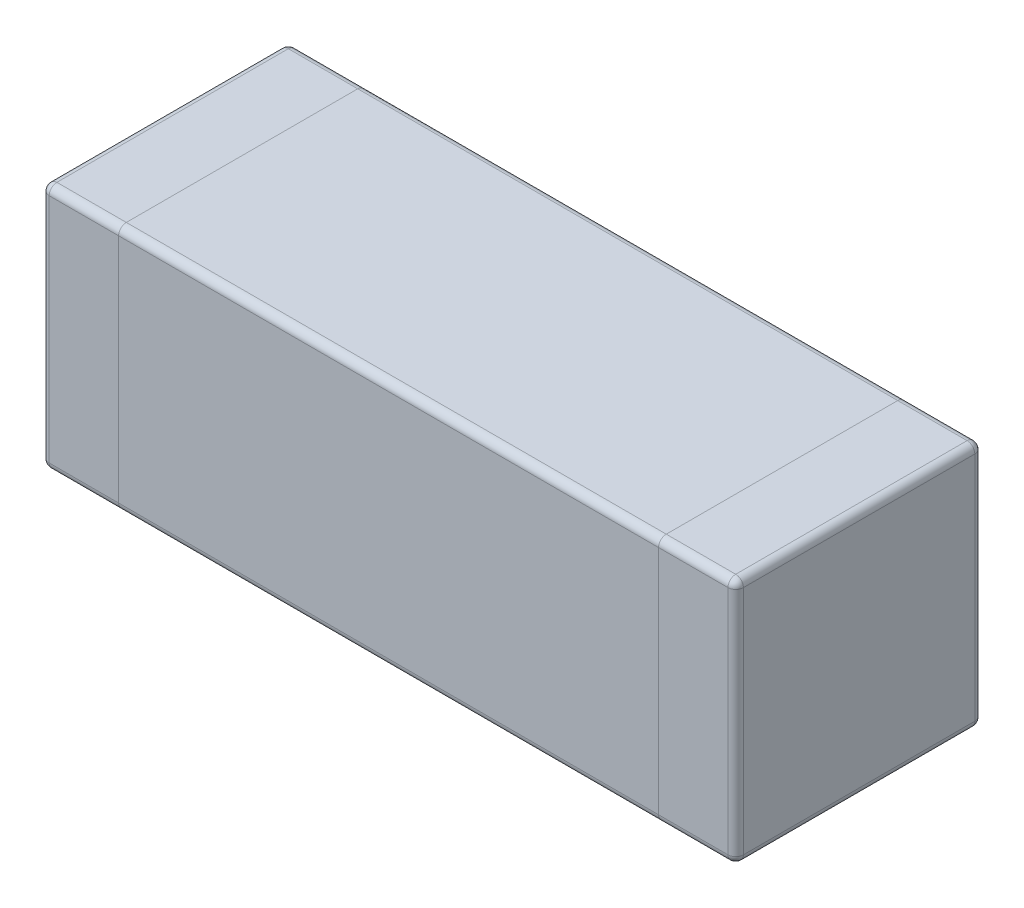
ISO-10303-21;
HEADER;
FILE_DESCRIPTION(('STEP AP214'),'2;1');
FILE_NAME('part.step','',(''),(''),'','','');
FILE_SCHEMA(('AUTOMOTIVE_DESIGN { 1 0 10303 214 1 1 1 1 }'));
ENDSEC;
DATA;
#1=APPLICATION_CONTEXT('core data for automotive mechanical design processes');
#2=APPLICATION_PROTOCOL_DEFINITION('international standard','automotive_design',2000,#1);
#3=PRODUCT_CONTEXT('',#1,'mechanical');
#4=PRODUCT('Part','Part','',(#3));
#5=PRODUCT_RELATED_PRODUCT_CATEGORY('part','',(#4));
#6=PRODUCT_DEFINITION_FORMATION('','',#4);
#7=PRODUCT_DEFINITION_CONTEXT('part definition',#1,'design');
#8=PRODUCT_DEFINITION('design','',#6,#7);
#9=PRODUCT_DEFINITION_SHAPE('','',#8);
#10=(LENGTH_UNIT() NAMED_UNIT(*) SI_UNIT(.MILLI.,.METRE.));
#11=(NAMED_UNIT(*) PLANE_ANGLE_UNIT() SI_UNIT($,.RADIAN.));
#12=(NAMED_UNIT(*) SI_UNIT($,.STERADIAN.) SOLID_ANGLE_UNIT());
#13=UNCERTAINTY_MEASURE_WITH_UNIT(LENGTH_MEASURE(1.E-05),#10,'distance_accuracy_value','');
#14=(GEOMETRIC_REPRESENTATION_CONTEXT(3) GLOBAL_UNCERTAINTY_ASSIGNED_CONTEXT((#13)) GLOBAL_UNIT_ASSIGNED_CONTEXT((#10,
#11,#12)) REPRESENTATION_CONTEXT('',''));
#15=CARTESIAN_POINT('',(0.,0.,0.));
#16=DIRECTION('',(0.,0.,1.));
#17=DIRECTION('',(1.,0.,0.));
#18=AXIS2_PLACEMENT_3D('',#15,#16,#17);
#19=CARTESIAN_POINT('',(2.25,1.6,-0.8));
#20=DIRECTION('',(0.,-1.,0.));
#21=DIRECTION('',(0.,0.,-1.));
#22=AXIS2_PLACEMENT_3D('',#19,#20,#21);
#23=PLANE('',#22);
#24=DIRECTION('',(0.,0.,1.));
#25=VECTOR('',#24,1.);
#26=CARTESIAN_POINT('',(-1.75,1.6,-0.8));
#27=LINE('',#26,#25);
#28=CARTESIAN_POINT('',(-1.75,1.6,-0.75));
#29=VERTEX_POINT('',#28);
#30=CARTESIAN_POINT('',(-1.75,1.6,0.75));
#31=VERTEX_POINT('',#30);
#32=EDGE_CURVE('E11',#29,#31,#27,.T.);
#33=ORIENTED_EDGE('',*,*,#32,.F.);
#34=DIRECTION('',(-1.,0.,0.));
#35=VECTOR('',#34,1.);
#36=CARTESIAN_POINT('',(2.25,1.6,-0.75));
#37=LINE('',#36,#35);
#38=CARTESIAN_POINT('',(-2.2,1.6,-0.75));
#39=VERTEX_POINT('',#38);
#40=EDGE_CURVE('E253',#29,#39,#37,.T.);
#41=ORIENTED_EDGE('',*,*,#40,.T.);
#42=DIRECTION('',(0.,0.,1.));
#43=VECTOR('',#42,1.);
#44=CARTESIAN_POINT('',(-2.2,1.6,-0.8));
#45=LINE('',#44,#43);
#46=CARTESIAN_POINT('',(-2.2,1.6,0.75));
#47=VERTEX_POINT('',#46);
#48=EDGE_CURVE('E256',#39,#47,#45,.T.);
#49=ORIENTED_EDGE('',*,*,#48,.T.);
#50=DIRECTION('',(1.,0.,0.));
#51=VECTOR('',#50,1.);
#52=CARTESIAN_POINT('',(2.25,1.6,0.75));
#53=LINE('',#52,#51);
#54=EDGE_CURVE('E260',#47,#31,#53,.T.);
#55=ORIENTED_EDGE('',*,*,#54,.T.);
#56=EDGE_LOOP('',(#33,#41,#49,#55));
#57=FACE_BOUND('',#56,.T.);
#58=ADVANCED_FACE('F37',(#57),#23,.F.);
#59=DIRECTION('',(0.,0.,-1.));
#60=VECTOR('',#59,1.);
#61=CARTESIAN_POINT('',(1.75,1.6,-0.8));
#62=LINE('',#61,#60);
#63=CARTESIAN_POINT('',(1.75,1.6,0.75));
#64=VERTEX_POINT('',#63);
#65=CARTESIAN_POINT('',(1.75,1.6,-0.75));
#66=VERTEX_POINT('',#65);
#67=EDGE_CURVE('E47',#64,#66,#62,.T.);
#68=ORIENTED_EDGE('',*,*,#67,.F.);
#69=CARTESIAN_POINT('',(2.2,1.6,0.75));
#70=VERTEX_POINT('',#69);
#71=EDGE_CURVE('E259',#64,#70,#53,.T.);
#72=ORIENTED_EDGE('',*,*,#71,.T.);
#73=DIRECTION('',(0.,0.,-1.));
#74=VECTOR('',#73,1.);
#75=CARTESIAN_POINT('',(2.2,1.6,-0.8));
#76=LINE('',#75,#74);
#77=CARTESIAN_POINT('',(2.2,1.6,-0.75));
#78=VERTEX_POINT('',#77);
#79=EDGE_CURVE('E250',#70,#78,#76,.T.);
#80=ORIENTED_EDGE('',*,*,#79,.T.);
#81=EDGE_CURVE('E254',#78,#66,#37,.T.);
#82=ORIENTED_EDGE('',*,*,#81,.T.);
#83=EDGE_LOOP('',(#68,#72,#80,#82));
#84=FACE_BOUND('',#83,.T.);
#85=ADVANCED_FACE('F526',(#84),#23,.F.);
#86=CARTESIAN_POINT('',(2.25,1.55,0.75));
#87=DIRECTION('',(1.,0.,0.));
#88=DIRECTION('',(0.,0.,-1.));
#89=AXIS2_PLACEMENT_3D('',#86,#87,#88);
#90=CYLINDRICAL_SURFACE('',#89,0.05);
#91=DIRECTION('',(1.,0.,0.));
#92=VECTOR('',#91,1.);
#93=CARTESIAN_POINT('',(-2.25,1.55,0.8));
#94=LINE('',#93,#92);
#95=CARTESIAN_POINT('',(-1.75,1.55,0.8));
#96=VERTEX_POINT('',#95);
#97=CARTESIAN_POINT('',(-2.2,1.55,0.8));
#98=VERTEX_POINT('',#97);
#99=EDGE_CURVE('E246',#96,#98,#94,.F.);
#100=ORIENTED_EDGE('',*,*,#99,.F.);
#101=CARTESIAN_POINT('',(-1.75,1.55,0.75));
#102=DIRECTION('',(1.,0.,0.));
#103=DIRECTION('',(0.,0.,-1.));
#104=AXIS2_PLACEMENT_3D('',#101,#102,#103);
#105=CIRCLE('',#104,0.05);
#106=EDGE_CURVE('E354',#96,#31,#105,.F.);
#107=ORIENTED_EDGE('',*,*,#106,.T.);
#108=ORIENTED_EDGE('',*,*,#54,.F.);
#109=CARTESIAN_POINT('',(-2.2,1.55,0.75));
#110=DIRECTION('',(-1.,0.,0.));
#111=DIRECTION('',(0.,-1.,0.));
#112=AXIS2_PLACEMENT_3D('',#109,#110,#111);
#113=CIRCLE('',#112,0.05);
#114=EDGE_CURVE('E330',#47,#98,#113,.F.);
#115=ORIENTED_EDGE('',*,*,#114,.T.);
#116=EDGE_LOOP('',(#100,#107,#108,#115));
#117=FACE_BOUND('',#116,.T.);
#118=ADVANCED_FACE('F483',(#117),#90,.T.);
#119=ORIENTED_EDGE('',*,*,#71,.F.);
#120=CARTESIAN_POINT('',(1.75,1.55,0.75));
#121=DIRECTION('',(-1.,0.,0.));
#122=DIRECTION('',(0.,0.,1.));
#123=AXIS2_PLACEMENT_3D('',#120,#121,#122);
#124=CIRCLE('',#123,0.05);
#125=CARTESIAN_POINT('',(1.75,1.55,0.8));
#126=VERTEX_POINT('',#125);
#127=EDGE_CURVE('E353',#64,#126,#124,.F.);
#128=ORIENTED_EDGE('',*,*,#127,.T.);
#129=CARTESIAN_POINT('',(2.2,1.55,0.8));
#130=VERTEX_POINT('',#129);
#131=EDGE_CURVE('E247',#130,#126,#94,.F.);
#132=ORIENTED_EDGE('',*,*,#131,.F.);
#133=CARTESIAN_POINT('',(2.2,1.55,0.75));
#134=DIRECTION('',(1.,0.,0.));
#135=DIRECTION('',(0.,0.,-1.));
#136=AXIS2_PLACEMENT_3D('',#133,#134,#135);
#137=CIRCLE('',#136,0.05);
#138=EDGE_CURVE('E315',#70,#130,#137,.T.);
#139=ORIENTED_EDGE('',*,*,#138,.F.);
#140=EDGE_LOOP('',(#119,#128,#132,#139));
#141=FACE_BOUND('',#140,.T.);
#142=ADVANCED_FACE('F457',(#141),#90,.T.);
#143=CARTESIAN_POINT('',(-2.25,1.6,0.8));
#144=DIRECTION('',(0.,0.,-1.));
#145=DIRECTION('',(-1.,0.,0.));
#146=AXIS2_PLACEMENT_3D('',#143,#144,#145);
#147=PLANE('',#146);
#148=DIRECTION('',(0.,-1.,0.));
#149=VECTOR('',#148,1.);
#150=CARTESIAN_POINT('',(-1.75,1.6,0.8));
#151=LINE('',#150,#149);
#152=CARTESIAN_POINT('',(-1.75,0.0499999999999999,0.8));
#153=VERTEX_POINT('',#152);
#154=EDGE_CURVE('E349',#96,#153,#151,.T.);
#155=ORIENTED_EDGE('',*,*,#154,.F.);
#156=ORIENTED_EDGE('',*,*,#99,.T.);
#157=DIRECTION('',(0.,-1.,0.));
#158=VECTOR('',#157,1.);
#159=CARTESIAN_POINT('',(-2.2,1.6,0.8));
#160=LINE('',#159,#158);
#161=CARTESIAN_POINT('',(-2.2,0.0499999999999999,0.8));
#162=VERTEX_POINT('',#161);
#163=EDGE_CURVE('E243',#98,#162,#160,.T.);
#164=ORIENTED_EDGE('',*,*,#163,.T.);
#165=DIRECTION('',(1.,0.,0.));
#166=VECTOR('',#165,1.);
#167=CARTESIAN_POINT('',(2.25,0.0499999999999999,0.8));
#168=LINE('',#167,#166);
#169=EDGE_CURVE('E237',#162,#153,#168,.T.);
#170=ORIENTED_EDGE('',*,*,#169,.T.);
#171=EDGE_LOOP('',(#155,#156,#164,#170));
#172=FACE_BOUND('',#171,.T.);
#173=ADVANCED_FACE('F471',(#172),#147,.F.);
#174=DIRECTION('',(0.,1.,0.));
#175=VECTOR('',#174,1.);
#176=CARTESIAN_POINT('',(1.75,1.6,0.8));
#177=LINE('',#176,#175);
#178=CARTESIAN_POINT('',(1.75,0.0499999999999999,0.8));
#179=VERTEX_POINT('',#178);
#180=EDGE_CURVE('E345',#179,#126,#177,.T.);
#181=ORIENTED_EDGE('',*,*,#180,.F.);
#182=CARTESIAN_POINT('',(2.2,0.0499999999999999,0.8));
#183=VERTEX_POINT('',#182);
#184=EDGE_CURVE('E236',#179,#183,#168,.T.);
#185=ORIENTED_EDGE('',*,*,#184,.T.);
#186=DIRECTION('',(0.,-1.,0.));
#187=VECTOR('',#186,1.);
#188=CARTESIAN_POINT('',(2.2,1.6,0.8));
#189=LINE('',#188,#187);
#190=EDGE_CURVE('E240',#183,#130,#189,.F.);
#191=ORIENTED_EDGE('',*,*,#190,.T.);
#192=ORIENTED_EDGE('',*,*,#131,.T.);
#193=EDGE_LOOP('',(#181,#185,#191,#192));
#194=FACE_BOUND('',#193,.T.);
#195=ADVANCED_FACE('F453',(#194),#147,.F.);
#196=CARTESIAN_POINT('',(-2.25,0.0499999999999999,0.75));
#197=DIRECTION('',(-1.,0.,0.));
#198=DIRECTION('',(0.,0.,1.));
#199=AXIS2_PLACEMENT_3D('',#196,#197,#198);
#200=CYLINDRICAL_SURFACE('',#199,0.05);
#201=DIRECTION('',(1.,0.,0.));
#202=VECTOR('',#201,1.);
#203=CARTESIAN_POINT('',(-2.25,0.,0.75));
#204=LINE('',#203,#202);
#205=CARTESIAN_POINT('',(-1.75,0.,0.75));
#206=VERTEX_POINT('',#205);
#207=CARTESIAN_POINT('',(-2.2,0.,0.75));
#208=VERTEX_POINT('',#207);
#209=EDGE_CURVE('E266',#206,#208,#204,.F.);
#210=ORIENTED_EDGE('',*,*,#209,.F.);
#211=CARTESIAN_POINT('',(-1.75,0.0499999999999999,0.75));
#212=DIRECTION('',(1.,0.,0.));
#213=DIRECTION('',(0.,0.,-1.));
#214=AXIS2_PLACEMENT_3D('',#211,#212,#213);
#215=CIRCLE('',#214,0.05);
#216=EDGE_CURVE('E350',#206,#153,#215,.F.);
#217=ORIENTED_EDGE('',*,*,#216,.T.);
#218=ORIENTED_EDGE('',*,*,#169,.F.);
#219=CARTESIAN_POINT('',(-2.2,0.05,0.75));
#220=DIRECTION('',(-1.,0.,0.));
#221=DIRECTION('',(0.,0.,1.));
#222=AXIS2_PLACEMENT_3D('',#219,#220,#221);
#223=CIRCLE('',#222,0.05);
#224=EDGE_CURVE('E321',#162,#208,#223,.F.);
#225=ORIENTED_EDGE('',*,*,#224,.T.);
#226=EDGE_LOOP('',(#210,#217,#218,#225));
#227=FACE_BOUND('',#226,.T.);
#228=ADVANCED_FACE('F509',(#227),#200,.T.);
#229=ORIENTED_EDGE('',*,*,#184,.F.);
#230=CARTESIAN_POINT('',(1.75,0.0499999999999999,0.75));
#231=DIRECTION('',(-1.,0.,0.));
#232=DIRECTION('',(0.,0.,1.));
#233=AXIS2_PLACEMENT_3D('',#230,#231,#232);
#234=CIRCLE('',#233,0.05);
#235=CARTESIAN_POINT('',(1.75,0.,0.75));
#236=VERTEX_POINT('',#235);
#237=EDGE_CURVE('E365',#179,#236,#234,.F.);
#238=ORIENTED_EDGE('',*,*,#237,.T.);
#239=CARTESIAN_POINT('',(2.2,0.,0.75));
#240=VERTEX_POINT('',#239);
#241=EDGE_CURVE('E267',#240,#236,#204,.F.);
#242=ORIENTED_EDGE('',*,*,#241,.F.);
#243=CARTESIAN_POINT('',(2.2,0.0499999999999999,0.75));
#244=DIRECTION('',(1.,0.,0.));
#245=DIRECTION('',(0.,0.,-1.));
#246=AXIS2_PLACEMENT_3D('',#243,#244,#245);
#247=CIRCLE('',#246,0.05);
#248=EDGE_CURVE('E301',#183,#240,#247,.T.);
#249=ORIENTED_EDGE('',*,*,#248,.F.);
#250=EDGE_LOOP('',(#229,#238,#242,#249));
#251=FACE_BOUND('',#250,.T.);
#252=ADVANCED_FACE('F443',(#251),#200,.T.);
#253=CARTESIAN_POINT('',(2.25,0.,-0.8));
#254=DIRECTION('',(0.,-1.,0.));
#255=DIRECTION('',(0.,0.,-1.));
#256=AXIS2_PLACEMENT_3D('',#253,#254,#255);
#257=PLANE('',#256);
#258=DIRECTION('',(-1.,0.,0.));
#259=VECTOR('',#258,1.);
#260=CARTESIAN_POINT('',(2.25,0.,-0.75));
#261=LINE('',#260,#259);
#262=CARTESIAN_POINT('',(-2.2,0.,-0.75));
#263=VERTEX_POINT('',#262);
#264=CARTESIAN_POINT('',(-1.75,0.,-0.75));
#265=VERTEX_POINT('',#264);
#266=EDGE_CURVE('E274',#263,#265,#261,.F.);
#267=ORIENTED_EDGE('',*,*,#266,.T.);
#268=DIRECTION('',(0.,0.,1.));
#269=VECTOR('',#268,1.);
#270=CARTESIAN_POINT('',(-1.75,0.,-0.8));
#271=LINE('',#270,#269);
#272=EDGE_CURVE('E366',#265,#206,#271,.T.);
#273=ORIENTED_EDGE('',*,*,#272,.T.);
#274=ORIENTED_EDGE('',*,*,#209,.T.);
#275=DIRECTION('',(0.,0.,1.));
#276=VECTOR('',#275,1.);
#277=CARTESIAN_POINT('',(-2.2,0.,-0.8));
#278=LINE('',#277,#276);
#279=EDGE_CURVE('E270',#208,#263,#278,.F.);
#280=ORIENTED_EDGE('',*,*,#279,.T.);
#281=EDGE_LOOP('',(#267,#273,#274,#280));
#282=FACE_BOUND('',#281,.T.);
#283=ADVANCED_FACE('F512',(#282),#257,.T.);
#284=ORIENTED_EDGE('',*,*,#241,.T.);
#285=DIRECTION('',(0.,0.,-1.));
#286=VECTOR('',#285,1.);
#287=CARTESIAN_POINT('',(1.75,0.,-0.8));
#288=LINE('',#287,#286);
#289=CARTESIAN_POINT('',(1.75,0.,-0.75));
#290=VERTEX_POINT('',#289);
#291=EDGE_CURVE('E360',#236,#290,#288,.T.);
#292=ORIENTED_EDGE('',*,*,#291,.T.);
#293=CARTESIAN_POINT('',(2.2,0.,-0.75));
#294=VERTEX_POINT('',#293);
#295=EDGE_CURVE('E273',#290,#294,#261,.F.);
#296=ORIENTED_EDGE('',*,*,#295,.T.);
#297=DIRECTION('',(0.,0.,-1.));
#298=VECTOR('',#297,1.);
#299=CARTESIAN_POINT('',(2.2,0.,0.8));
#300=LINE('',#299,#298);
#301=EDGE_CURVE('E263',#294,#240,#300,.F.);
#302=ORIENTED_EDGE('',*,*,#301,.T.);
#303=EDGE_LOOP('',(#284,#292,#296,#302));
#304=FACE_BOUND('',#303,.T.);
#305=ADVANCED_FACE('F387',(#304),#257,.T.);
#306=CARTESIAN_POINT('',(2.25,1.55,-0.75));
#307=DIRECTION('',(-1.,0.,0.));
#308=DIRECTION('',(0.,0.,1.));
#309=AXIS2_PLACEMENT_3D('',#306,#307,#308);
#310=CYLINDRICAL_SURFACE('',#309,0.05);
#311=ORIENTED_EDGE('',*,*,#40,.F.);
#312=CARTESIAN_POINT('',(-1.75,1.55,-0.75));
#313=DIRECTION('',(1.,0.,0.));
#314=DIRECTION('',(0.,0.,-1.));
#315=AXIS2_PLACEMENT_3D('',#312,#313,#314);
#316=CIRCLE('',#315,0.05);
#317=CARTESIAN_POINT('',(-1.75,1.55,-0.8));
#318=VERTEX_POINT('',#317);
#319=EDGE_CURVE('E357',#29,#318,#316,.F.);
#320=ORIENTED_EDGE('',*,*,#319,.T.);
#321=DIRECTION('',(-1.,0.,0.));
#322=VECTOR('',#321,1.);
#323=CARTESIAN_POINT('',(-2.25,1.55,-0.8));
#324=LINE('',#323,#322);
#325=CARTESIAN_POINT('',(-2.2,1.55,-0.8));
#326=VERTEX_POINT('',#325);
#327=EDGE_CURVE('E216',#326,#318,#324,.F.);
#328=ORIENTED_EDGE('',*,*,#327,.F.);
#329=CARTESIAN_POINT('',(-2.2,1.55,-0.75));
#330=DIRECTION('',(-1.,0.,0.));
#331=DIRECTION('',(0.,0.,1.));
#332=AXIS2_PLACEMENT_3D('',#329,#330,#331);
#333=CIRCLE('',#332,0.05);
#334=EDGE_CURVE('E292',#326,#39,#333,.F.);
#335=ORIENTED_EDGE('',*,*,#334,.T.);
#336=EDGE_LOOP('',(#311,#320,#328,#335));
#337=FACE_BOUND('',#336,.T.);
#338=ADVANCED_FACE('F519',(#337),#310,.T.);
#339=CARTESIAN_POINT('',(1.75,1.55,-0.8));
#340=VERTEX_POINT('',#339);
#341=CARTESIAN_POINT('',(2.2,1.55,-0.8));
#342=VERTEX_POINT('',#341);
#343=EDGE_CURVE('E211',#340,#342,#324,.F.);
#344=ORIENTED_EDGE('',*,*,#343,.F.);
#345=CARTESIAN_POINT('',(1.75,1.55,-0.75));
#346=DIRECTION('',(-1.,0.,0.));
#347=DIRECTION('',(0.,0.,1.));
#348=AXIS2_PLACEMENT_3D('',#345,#346,#347);
#349=CIRCLE('',#348,0.05);
#350=EDGE_CURVE('E361',#340,#66,#349,.F.);
#351=ORIENTED_EDGE('',*,*,#350,.T.);
#352=ORIENTED_EDGE('',*,*,#81,.F.);
#353=CARTESIAN_POINT('',(2.2,1.55,-0.75));
#354=DIRECTION('',(1.,0.,0.));
#355=DIRECTION('',(0.,0.,-1.));
#356=AXIS2_PLACEMENT_3D('',#353,#354,#355);
#357=CIRCLE('',#356,0.05);
#358=EDGE_CURVE('E196',#342,#78,#357,.T.);
#359=ORIENTED_EDGE('',*,*,#358,.F.);
#360=EDGE_LOOP('',(#344,#351,#352,#359));
#361=FACE_BOUND('',#360,.T.);
#362=ADVANCED_FACE('F422',(#361),#310,.T.);
#363=CARTESIAN_POINT('',(-2.25,0.0499999999999999,-0.75));
#364=DIRECTION('',(1.,0.,0.));
#365=DIRECTION('',(0.,0.,-1.));
#366=AXIS2_PLACEMENT_3D('',#363,#364,#365);
#367=CYLINDRICAL_SURFACE('',#366,0.05);
#368=DIRECTION('',(-1.,0.,0.));
#369=VECTOR('',#368,1.);
#370=CARTESIAN_POINT('',(-2.25,0.0499999999999999,-0.8));
#371=LINE('',#370,#369);
#372=CARTESIAN_POINT('',(-1.75,0.0499999999999999,-0.8));
#373=VERTEX_POINT('',#372);
#374=CARTESIAN_POINT('',(-2.2,0.0499999999999999,-0.8));
#375=VERTEX_POINT('',#374);
#376=EDGE_CURVE('E208',#373,#375,#371,.T.);
#377=ORIENTED_EDGE('',*,*,#376,.F.);
#378=CARTESIAN_POINT('',(-1.75,0.0499999999999999,-0.75));
#379=DIRECTION('',(1.,0.,0.));
#380=DIRECTION('',(0.,0.,-1.));
#381=AXIS2_PLACEMENT_3D('',#378,#379,#380);
#382=CIRCLE('',#381,0.05);
#383=EDGE_CURVE('E370',#373,#265,#382,.F.);
#384=ORIENTED_EDGE('',*,*,#383,.T.);
#385=ORIENTED_EDGE('',*,*,#266,.F.);
#386=CARTESIAN_POINT('',(-2.2,0.0499999999999999,-0.75));
#387=DIRECTION('',(-1.,0.,0.));
#388=DIRECTION('',(0.,0.,1.));
#389=AXIS2_PLACEMENT_3D('',#386,#387,#388);
#390=CIRCLE('',#389,0.05);
#391=EDGE_CURVE('E289',#263,#375,#390,.F.);
#392=ORIENTED_EDGE('',*,*,#391,.T.);
#393=EDGE_LOOP('',(#377,#384,#385,#392));
#394=FACE_BOUND('',#393,.T.);
#395=ADVANCED_FACE('F405',(#394),#367,.T.);
#396=ORIENTED_EDGE('',*,*,#295,.F.);
#397=CARTESIAN_POINT('',(1.75,0.0499999999999999,-0.75));
#398=DIRECTION('',(-1.,0.,0.));
#399=DIRECTION('',(0.,0.,1.));
#400=AXIS2_PLACEMENT_3D('',#397,#398,#399);
#401=CIRCLE('',#400,0.05);
#402=CARTESIAN_POINT('',(1.75,0.0499999999999999,-0.8));
#403=VERTEX_POINT('',#402);
#404=EDGE_CURVE('E41',#290,#403,#401,.F.);
#405=ORIENTED_EDGE('',*,*,#404,.T.);
#406=CARTESIAN_POINT('',(2.2,0.0499999999999999,-0.8));
#407=VERTEX_POINT('',#406);
#408=EDGE_CURVE('E199',#407,#403,#371,.T.);
#409=ORIENTED_EDGE('',*,*,#408,.F.);
#410=CARTESIAN_POINT('',(2.2,0.05,-0.75));
#411=DIRECTION('',(1.,0.,0.));
#412=DIRECTION('',(0.,0.,-1.));
#413=AXIS2_PLACEMENT_3D('',#410,#411,#412);
#414=CIRCLE('',#413,0.05);
#415=EDGE_CURVE('E188',#294,#407,#414,.T.);
#416=ORIENTED_EDGE('',*,*,#415,.F.);
#417=EDGE_LOOP('',(#396,#405,#409,#416));
#418=FACE_BOUND('',#417,.T.);
#419=ADVANCED_FACE('F200',(#418),#367,.T.);
#420=CARTESIAN_POINT('',(-2.25,1.6,-0.8));
#421=DIRECTION('',(0.,0.,1.));
#422=DIRECTION('',(1.,0.,0.));
#423=AXIS2_PLACEMENT_3D('',#420,#421,#422);
#424=PLANE('',#423);
#425=DIRECTION('',(0.,1.,0.));
#426=VECTOR('',#425,1.);
#427=CARTESIAN_POINT('',(-1.75,1.6,-0.8));
#428=LINE('',#427,#426);
#429=EDGE_CURVE('E341',#373,#318,#428,.T.);
#430=ORIENTED_EDGE('',*,*,#429,.F.);
#431=ORIENTED_EDGE('',*,*,#376,.T.);
#432=DIRECTION('',(0.,-1.,0.));
#433=VECTOR('',#432,1.);
#434=CARTESIAN_POINT('',(-2.2,1.6,-0.8));
#435=LINE('',#434,#433);
#436=EDGE_CURVE('E205',#375,#326,#435,.F.);
#437=ORIENTED_EDGE('',*,*,#436,.T.);
#438=ORIENTED_EDGE('',*,*,#327,.T.);
#439=EDGE_LOOP('',(#430,#431,#437,#438));
#440=FACE_BOUND('',#439,.T.);
#441=ADVANCED_FACE('F408',(#440),#424,.F.);
#442=DIRECTION('',(0.,-1.,0.));
#443=VECTOR('',#442,1.);
#444=CARTESIAN_POINT('',(1.75,1.6,-0.8));
#445=LINE('',#444,#443);
#446=EDGE_CURVE('E276',#340,#403,#445,.T.);
#447=ORIENTED_EDGE('',*,*,#446,.F.);
#448=ORIENTED_EDGE('',*,*,#343,.T.);
#449=DIRECTION('',(0.,-1.,0.));
#450=VECTOR('',#449,1.);
#451=CARTESIAN_POINT('',(2.2,1.6,-0.8));
#452=LINE('',#451,#450);
#453=EDGE_CURVE('E180',#342,#407,#452,.T.);
#454=ORIENTED_EDGE('',*,*,#453,.T.);
#455=ORIENTED_EDGE('',*,*,#408,.T.);
#456=EDGE_LOOP('',(#447,#448,#454,#455));
#457=FACE_BOUND('',#456,.T.);
#458=ADVANCED_FACE('F209',(#457),#424,.F.);
#459=CARTESIAN_POINT('',(2.25,1.6,0.8));
#460=DIRECTION('',(-1.,0.,0.));
#461=DIRECTION('',(0.,0.,1.));
#462=AXIS2_PLACEMENT_3D('',#459,#460,#461);
#463=PLANE('',#462);
#464=DIRECTION('',(0.,-1.,0.));
#465=VECTOR('',#464,1.);
#466=CARTESIAN_POINT('',(2.25,1.6,-0.75));
#467=LINE('',#466,#465);
#468=CARTESIAN_POINT('',(2.25,0.0499999999999999,-0.75));
#469=VERTEX_POINT('',#468);
#470=CARTESIAN_POINT('',(2.25,1.55,-0.75));
#471=VERTEX_POINT('',#470);
#472=EDGE_CURVE('E182',#469,#471,#467,.F.);
#473=ORIENTED_EDGE('',*,*,#472,.T.);
#474=DIRECTION('',(0.,0.,-1.));
#475=VECTOR('',#474,1.);
#476=CARTESIAN_POINT('',(2.25,1.55,0.8));
#477=LINE('',#476,#475);
#478=CARTESIAN_POINT('',(2.25,1.55,0.75));
#479=VERTEX_POINT('',#478);
#480=EDGE_CURVE('E225',#471,#479,#477,.F.);
#481=ORIENTED_EDGE('',*,*,#480,.T.);
#482=DIRECTION('',(0.,-1.,0.));
#483=VECTOR('',#482,1.);
#484=CARTESIAN_POINT('',(2.25,1.6,0.75));
#485=LINE('',#484,#483);
#486=CARTESIAN_POINT('',(2.25,0.0499999999999999,0.75));
#487=VERTEX_POINT('',#486);
#488=EDGE_CURVE('E222',#479,#487,#485,.T.);
#489=ORIENTED_EDGE('',*,*,#488,.T.);
#490=DIRECTION('',(0.,0.,-1.));
#491=VECTOR('',#490,1.);
#492=CARTESIAN_POINT('',(2.25,0.0499999999999999,-0.8));
#493=LINE('',#492,#491);
#494=EDGE_CURVE('E220',#487,#469,#493,.T.);
#495=ORIENTED_EDGE('',*,*,#494,.T.);
#496=EDGE_LOOP('',(#473,#481,#489,#495));
#497=FACE_BOUND('',#496,.T.);
#498=ADVANCED_FACE('F434',(#497),#463,.F.);
#499=EDGE_CURVE('E206',#403,#373,#371,.T.);
#500=ORIENTED_EDGE('',*,*,#499,.T.);
#501=ORIENTED_EDGE('',*,*,#429,.T.);
#502=EDGE_CURVE('E214',#318,#340,#324,.F.);
#503=ORIENTED_EDGE('',*,*,#502,.T.);
#504=ORIENTED_EDGE('',*,*,#446,.T.);
#505=EDGE_LOOP('',(#500,#501,#503,#504));
#506=FACE_BOUND('',#505,.T.);
#507=ADVANCED_FACE('F414',(#506),#424,.F.);
#508=CARTESIAN_POINT('',(-2.25,1.6,0.8));
#509=DIRECTION('',(1.,0.,0.));
#510=DIRECTION('',(0.,0.,-1.));
#511=AXIS2_PLACEMENT_3D('',#508,#509,#510);
#512=PLANE('',#511);
#513=DIRECTION('',(0.,-1.,0.));
#514=VECTOR('',#513,1.);
#515=CARTESIAN_POINT('',(-2.25,1.6,0.75));
#516=LINE('',#515,#514);
#517=CARTESIAN_POINT('',(-2.25,0.0499999999999999,0.75));
#518=VERTEX_POINT('',#517);
#519=CARTESIAN_POINT('',(-2.25,1.55,0.75));
#520=VERTEX_POINT('',#519);
#521=EDGE_CURVE('E229',#518,#520,#516,.F.);
#522=ORIENTED_EDGE('',*,*,#521,.T.);
#523=DIRECTION('',(0.,0.,1.));
#524=VECTOR('',#523,1.);
#525=CARTESIAN_POINT('',(-2.25,1.55,0.8));
#526=LINE('',#525,#524);
#527=CARTESIAN_POINT('',(-2.25,1.55,-0.75));
#528=VERTEX_POINT('',#527);
#529=EDGE_CURVE('E234',#520,#528,#526,.F.);
#530=ORIENTED_EDGE('',*,*,#529,.T.);
#531=DIRECTION('',(0.,-1.,0.));
#532=VECTOR('',#531,1.);
#533=CARTESIAN_POINT('',(-2.25,1.6,-0.75));
#534=LINE('',#533,#532);
#535=CARTESIAN_POINT('',(-2.25,0.0499999999999999,-0.75));
#536=VERTEX_POINT('',#535);
#537=EDGE_CURVE('E231',#528,#536,#534,.T.);
#538=ORIENTED_EDGE('',*,*,#537,.T.);
#539=DIRECTION('',(0.,0.,1.));
#540=VECTOR('',#539,1.);
#541=CARTESIAN_POINT('',(-2.25,0.0499999999999999,0.8));
#542=LINE('',#541,#540);
#543=EDGE_CURVE('E227',#536,#518,#542,.T.);
#544=ORIENTED_EDGE('',*,*,#543,.T.);
#545=EDGE_LOOP('',(#522,#530,#538,#544));
#546=FACE_BOUND('',#545,.T.);
#547=ADVANCED_FACE('F491',(#546),#512,.F.);
#548=EDGE_CURVE('E251',#126,#96,#94,.F.);
#549=ORIENTED_EDGE('',*,*,#548,.T.);
#550=ORIENTED_EDGE('',*,*,#154,.T.);
#551=EDGE_CURVE('E241',#153,#179,#168,.T.);
#552=ORIENTED_EDGE('',*,*,#551,.T.);
#553=ORIENTED_EDGE('',*,*,#180,.T.);
#554=EDGE_LOOP('',(#549,#550,#552,#553));
#555=FACE_BOUND('',#554,.T.);
#556=ADVANCED_FACE('F464',(#555),#147,.F.);
#557=EDGE_CURVE('E257',#66,#29,#37,.T.);
#558=ORIENTED_EDGE('',*,*,#557,.T.);
#559=ORIENTED_EDGE('',*,*,#32,.T.);
#560=EDGE_CURVE('E264',#31,#64,#53,.T.);
#561=ORIENTED_EDGE('',*,*,#560,.T.);
#562=ORIENTED_EDGE('',*,*,#67,.T.);
#563=EDGE_LOOP('',(#558,#559,#561,#562));
#564=FACE_BOUND('',#563,.T.);
#565=ADVANCED_FACE('F524',(#564),#23,.F.);
#566=ORIENTED_EDGE('',*,*,#272,.F.);
#567=EDGE_CURVE('E277',#265,#290,#261,.F.);
#568=ORIENTED_EDGE('',*,*,#567,.T.);
#569=ORIENTED_EDGE('',*,*,#291,.F.);
#570=EDGE_CURVE('E271',#236,#206,#204,.F.);
#571=ORIENTED_EDGE('',*,*,#570,.T.);
#572=EDGE_LOOP('',(#566,#568,#569,#571));
#573=FACE_BOUND('',#572,.T.);
#574=ADVANCED_FACE('F399',(#573),#257,.T.);
#575=CARTESIAN_POINT('',(-2.2,1.6,0.75));
#576=DIRECTION('',(0.,-1.,0.));
#577=DIRECTION('',(0.,0.,-1.));
#578=AXIS2_PLACEMENT_3D('',#575,#576,#577);
#579=CYLINDRICAL_SURFACE('',#578,0.05);
#580=CARTESIAN_POINT('',(-2.2,1.55,0.75));
#581=DIRECTION('',(0.,1.,0.));
#582=DIRECTION('',(0.,0.,1.));
#583=AXIS2_PLACEMENT_3D('',#580,#581,#582);
#584=CIRCLE('',#583,0.05);
#585=EDGE_CURVE('E336',#520,#98,#584,.T.);
#586=ORIENTED_EDGE('',*,*,#585,.F.);
#587=ORIENTED_EDGE('',*,*,#521,.F.);
#588=CARTESIAN_POINT('',(-2.2,0.0499999999999999,0.75));
#589=DIRECTION('',(0.,-1.,0.));
#590=DIRECTION('',(0.,0.,-1.));
#591=AXIS2_PLACEMENT_3D('',#588,#589,#590);
#592=CIRCLE('',#591,0.05);
#593=EDGE_CURVE('E333',#162,#518,#592,.T.);
#594=ORIENTED_EDGE('',*,*,#593,.F.);
#595=ORIENTED_EDGE('',*,*,#163,.F.);
#596=EDGE_LOOP('',(#586,#587,#594,#595));
#597=FACE_BOUND('',#596,.T.);
#598=ADVANCED_FACE('F39',(#597),#579,.T.);
#599=CARTESIAN_POINT('',(-2.2,1.55,0.75));
#600=DIRECTION('',(0.,0.,1.));
#601=DIRECTION('',(1.,0.,0.));
#602=AXIS2_PLACEMENT_3D('',#599,#600,#601);
#603=SPHERICAL_SURFACE('',#602,0.05);
#604=CARTESIAN_POINT('',(-2.2,1.55,0.75));
#605=DIRECTION('',(0.,0.,1.));
#606=DIRECTION('',(1.,0.,0.));
#607=AXIS2_PLACEMENT_3D('',#604,#605,#606);
#608=CIRCLE('',#607,0.05);
#609=EDGE_CURVE('E327',#520,#47,#608,.F.);
#610=ORIENTED_EDGE('',*,*,#609,.F.);
#611=ORIENTED_EDGE('',*,*,#585,.T.);
#612=ORIENTED_EDGE('',*,*,#114,.F.);
#613=EDGE_LOOP('',(#610,#611,#612));
#614=FACE_BOUND('',#613,.T.);
#615=ADVANCED_FACE('F480',(#614),#603,.T.);
#616=CARTESIAN_POINT('',(-2.2,0.05,0.75));
#617=DIRECTION('',(0.,0.,1.));
#618=DIRECTION('',(1.,0.,0.));
#619=AXIS2_PLACEMENT_3D('',#616,#617,#618);
#620=SPHERICAL_SURFACE('',#619,0.05);
#621=ORIENTED_EDGE('',*,*,#224,.F.);
#622=ORIENTED_EDGE('',*,*,#593,.T.);
#623=CARTESIAN_POINT('',(-2.2,0.0499999999999999,0.75));
#624=DIRECTION('',(0.,0.,1.));
#625=DIRECTION('',(1.,0.,0.));
#626=AXIS2_PLACEMENT_3D('',#623,#624,#625);
#627=CIRCLE('',#626,0.05);
#628=EDGE_CURVE('E324',#208,#518,#627,.F.);
#629=ORIENTED_EDGE('',*,*,#628,.F.);
#630=EDGE_LOOP('',(#621,#622,#629));
#631=FACE_BOUND('',#630,.T.);
#632=ADVANCED_FACE('F507',(#631),#620,.T.);
#633=ORIENTED_EDGE('',*,*,#106,.F.);
#634=ORIENTED_EDGE('',*,*,#548,.F.);
#635=ORIENTED_EDGE('',*,*,#127,.F.);
#636=ORIENTED_EDGE('',*,*,#560,.F.);
#637=EDGE_LOOP('',(#633,#634,#635,#636));
#638=FACE_BOUND('',#637,.T.);
#639=ADVANCED_FACE('F466',(#638),#90,.T.);
#640=CARTESIAN_POINT('',(-2.2,1.55,-0.8));
#641=DIRECTION('',(0.,0.,1.));
#642=DIRECTION('',(1.,0.,0.));
#643=AXIS2_PLACEMENT_3D('',#640,#641,#642);
#644=CYLINDRICAL_SURFACE('',#643,0.05);
#645=ORIENTED_EDGE('',*,*,#609,.T.);
#646=ORIENTED_EDGE('',*,*,#48,.F.);
#647=CARTESIAN_POINT('',(-2.2,1.55,-0.75));
#648=DIRECTION('',(0.,0.,-1.));
#649=DIRECTION('',(0.,1.,0.));
#650=AXIS2_PLACEMENT_3D('',#647,#648,#649);
#651=CIRCLE('',#650,0.05);
#652=EDGE_CURVE('E312',#528,#39,#651,.T.);
#653=ORIENTED_EDGE('',*,*,#652,.F.);
#654=ORIENTED_EDGE('',*,*,#529,.F.);
#655=EDGE_LOOP('',(#645,#646,#653,#654));
#656=FACE_BOUND('',#655,.T.);
#657=ADVANCED_FACE('F488',(#656),#644,.T.);
#658=CARTESIAN_POINT('',(-2.2,1.6,-0.75));
#659=DIRECTION('',(0.,-1.,0.));
#660=DIRECTION('',(0.,0.,-1.));
#661=AXIS2_PLACEMENT_3D('',#658,#659,#660);
#662=CYLINDRICAL_SURFACE('',#661,0.05);
#663=CARTESIAN_POINT('',(-2.2,0.0499999999999999,-0.75));
#664=DIRECTION('',(0.,-1.,0.));
#665=DIRECTION('',(0.,0.,-1.));
#666=AXIS2_PLACEMENT_3D('',#663,#664,#665);
#667=CIRCLE('',#666,0.05);
#668=EDGE_CURVE('E306',#536,#375,#667,.T.);
#669=ORIENTED_EDGE('',*,*,#668,.F.);
#670=ORIENTED_EDGE('',*,*,#537,.F.);
#671=CARTESIAN_POINT('',(-2.2,1.55,-0.75));
#672=DIRECTION('',(0.,1.,0.));
#673=DIRECTION('',(0.,0.,1.));
#674=AXIS2_PLACEMENT_3D('',#671,#672,#673);
#675=CIRCLE('',#674,0.05);
#676=EDGE_CURVE('E309',#326,#528,#675,.T.);
#677=ORIENTED_EDGE('',*,*,#676,.F.);
#678=ORIENTED_EDGE('',*,*,#436,.F.);
#679=EDGE_LOOP('',(#669,#670,#677,#678));
#680=FACE_BOUND('',#679,.T.);
#681=ADVANCED_FACE('F495',(#680),#662,.T.);
#682=CARTESIAN_POINT('',(-2.2,0.0499999999999999,0.8));
#683=DIRECTION('',(0.,0.,-1.));
#684=DIRECTION('',(-1.,0.,0.));
#685=AXIS2_PLACEMENT_3D('',#682,#683,#684);
#686=CYLINDRICAL_SURFACE('',#685,0.05);
#687=ORIENTED_EDGE('',*,*,#628,.T.);
#688=ORIENTED_EDGE('',*,*,#543,.F.);
#689=CARTESIAN_POINT('',(-2.2,0.05,-0.75));
#690=DIRECTION('',(0.,0.,-1.));
#691=DIRECTION('',(-1.,0.,0.));
#692=AXIS2_PLACEMENT_3D('',#689,#690,#691);
#693=CIRCLE('',#692,0.05);
#694=EDGE_CURVE('E304',#263,#536,#693,.T.);
#695=ORIENTED_EDGE('',*,*,#694,.F.);
#696=ORIENTED_EDGE('',*,*,#279,.F.);
#697=EDGE_LOOP('',(#687,#688,#695,#696));
#698=FACE_BOUND('',#697,.T.);
#699=ADVANCED_FACE('F502',(#698),#686,.T.);
#700=ORIENTED_EDGE('',*,*,#216,.F.);
#701=ORIENTED_EDGE('',*,*,#570,.F.);
#702=ORIENTED_EDGE('',*,*,#237,.F.);
#703=ORIENTED_EDGE('',*,*,#551,.F.);
#704=EDGE_LOOP('',(#700,#701,#702,#703));
#705=FACE_BOUND('',#704,.T.);
#706=ADVANCED_FACE('F511',(#705),#200,.T.);
#707=CARTESIAN_POINT('',(2.2,1.6,0.75));
#708=DIRECTION('',(0.,-1.,0.));
#709=DIRECTION('',(0.,0.,-1.));
#710=AXIS2_PLACEMENT_3D('',#707,#708,#709);
#711=CYLINDRICAL_SURFACE('',#710,0.05);
#712=CARTESIAN_POINT('',(2.2,1.55,0.75));
#713=DIRECTION('',(0.,1.,0.));
#714=DIRECTION('',(0.,0.,1.));
#715=AXIS2_PLACEMENT_3D('',#712,#713,#714);
#716=CIRCLE('',#715,0.05);
#717=EDGE_CURVE('E318',#130,#479,#716,.T.);
#718=ORIENTED_EDGE('',*,*,#717,.F.);
#719=ORIENTED_EDGE('',*,*,#190,.F.);
#720=CARTESIAN_POINT('',(2.2,0.0499999999999999,0.75));
#721=DIRECTION('',(0.,-1.,0.));
#722=DIRECTION('',(0.,0.,-1.));
#723=AXIS2_PLACEMENT_3D('',#720,#721,#722);
#724=CIRCLE('',#723,0.05);
#725=EDGE_CURVE('E298',#487,#183,#724,.T.);
#726=ORIENTED_EDGE('',*,*,#725,.F.);
#727=ORIENTED_EDGE('',*,*,#488,.F.);
#728=EDGE_LOOP('',(#718,#719,#726,#727));
#729=FACE_BOUND('',#728,.T.);
#730=ADVANCED_FACE('F450',(#729),#711,.T.);
#731=CARTESIAN_POINT('',(2.2,1.55,0.75));
#732=DIRECTION('',(0.,0.,1.));
#733=DIRECTION('',(1.,0.,0.));
#734=AXIS2_PLACEMENT_3D('',#731,#732,#733);
#735=SPHERICAL_SURFACE('',#734,0.05);
#736=ORIENTED_EDGE('',*,*,#138,.T.);
#737=ORIENTED_EDGE('',*,*,#717,.T.);
#738=CARTESIAN_POINT('',(2.2,1.55,0.75));
#739=DIRECTION('',(0.,0.,1.));
#740=DIRECTION('',(0.,-1.,0.));
#741=AXIS2_PLACEMENT_3D('',#738,#739,#740);
#742=CIRCLE('',#741,0.05);
#743=EDGE_CURVE('E295',#70,#479,#742,.F.);
#744=ORIENTED_EDGE('',*,*,#743,.F.);
#745=EDGE_LOOP('',(#736,#737,#744));
#746=FACE_BOUND('',#745,.T.);
#747=ADVANCED_FACE('F535',(#746),#735,.T.);
#748=CARTESIAN_POINT('',(-2.2,1.55,-0.75));
#749=DIRECTION('',(0.,0.,1.));
#750=DIRECTION('',(1.,0.,0.));
#751=AXIS2_PLACEMENT_3D('',#748,#749,#750);
#752=SPHERICAL_SURFACE('',#751,0.05);
#753=ORIENTED_EDGE('',*,*,#676,.T.);
#754=ORIENTED_EDGE('',*,*,#652,.T.);
#755=ORIENTED_EDGE('',*,*,#334,.F.);
#756=EDGE_LOOP('',(#753,#754,#755));
#757=FACE_BOUND('',#756,.T.);
#758=ADVANCED_FACE('F537',(#757),#752,.T.);
#759=CARTESIAN_POINT('',(-2.2,0.05,-0.75));
#760=DIRECTION('',(0.,0.,1.));
#761=DIRECTION('',(1.,0.,0.));
#762=AXIS2_PLACEMENT_3D('',#759,#760,#761);
#763=SPHERICAL_SURFACE('',#762,0.05);
#764=ORIENTED_EDGE('',*,*,#694,.T.);
#765=ORIENTED_EDGE('',*,*,#668,.T.);
#766=ORIENTED_EDGE('',*,*,#391,.F.);
#767=EDGE_LOOP('',(#764,#765,#766));
#768=FACE_BOUND('',#767,.T.);
#769=ADVANCED_FACE('F543',(#768),#763,.T.);
#770=CARTESIAN_POINT('',(2.2,0.05,0.75));
#771=DIRECTION('',(0.,0.,1.));
#772=DIRECTION('',(1.,0.,0.));
#773=AXIS2_PLACEMENT_3D('',#770,#771,#772);
#774=SPHERICAL_SURFACE('',#773,0.05);
#775=ORIENTED_EDGE('',*,*,#725,.T.);
#776=ORIENTED_EDGE('',*,*,#248,.T.);
#777=CARTESIAN_POINT('',(2.2,0.05,0.75));
#778=DIRECTION('',(0.,0.,1.));
#779=DIRECTION('',(1.,0.,0.));
#780=AXIS2_PLACEMENT_3D('',#777,#778,#779);
#781=CIRCLE('',#780,0.05);
#782=EDGE_CURVE('E286',#487,#240,#781,.F.);
#783=ORIENTED_EDGE('',*,*,#782,.F.);
#784=EDGE_LOOP('',(#775,#776,#783));
#785=FACE_BOUND('',#784,.T.);
#786=ADVANCED_FACE('F446',(#785),#774,.T.);
#787=CARTESIAN_POINT('',(2.2,1.55,-0.8));
#788=DIRECTION('',(0.,0.,-1.));
#789=DIRECTION('',(-1.,0.,0.));
#790=AXIS2_PLACEMENT_3D('',#787,#788,#789);
#791=CYLINDRICAL_SURFACE('',#790,0.05);
#792=ORIENTED_EDGE('',*,*,#743,.T.);
#793=ORIENTED_EDGE('',*,*,#480,.F.);
#794=CARTESIAN_POINT('',(2.2,1.55,-0.75));
#795=DIRECTION('',(0.,0.,-1.));
#796=DIRECTION('',(-1.,0.,0.));
#797=AXIS2_PLACEMENT_3D('',#794,#795,#796);
#798=CIRCLE('',#797,0.05);
#799=EDGE_CURVE('E283',#78,#471,#798,.T.);
#800=ORIENTED_EDGE('',*,*,#799,.F.);
#801=ORIENTED_EDGE('',*,*,#79,.F.);
#802=EDGE_LOOP('',(#792,#793,#800,#801));
#803=FACE_BOUND('',#802,.T.);
#804=ADVANCED_FACE('F430',(#803),#791,.T.);
#805=ORIENTED_EDGE('',*,*,#319,.F.);
#806=ORIENTED_EDGE('',*,*,#557,.F.);
#807=ORIENTED_EDGE('',*,*,#350,.F.);
#808=ORIENTED_EDGE('',*,*,#502,.F.);
#809=EDGE_LOOP('',(#805,#806,#807,#808));
#810=FACE_BOUND('',#809,.T.);
#811=ADVANCED_FACE('F417',(#810),#310,.T.);
#812=ORIENTED_EDGE('',*,*,#383,.F.);
#813=ORIENTED_EDGE('',*,*,#499,.F.);
#814=ORIENTED_EDGE('',*,*,#404,.F.);
#815=ORIENTED_EDGE('',*,*,#567,.F.);
#816=EDGE_LOOP('',(#812,#813,#814,#815));
#817=FACE_BOUND('',#816,.T.);
#818=ADVANCED_FACE('F396',(#817),#367,.T.);
#819=CARTESIAN_POINT('',(2.2,0.0499999999999999,0.8));
#820=DIRECTION('',(0.,0.,1.));
#821=DIRECTION('',(1.,0.,0.));
#822=AXIS2_PLACEMENT_3D('',#819,#820,#821);
#823=CYLINDRICAL_SURFACE('',#822,0.05);
#824=ORIENTED_EDGE('',*,*,#782,.T.);
#825=ORIENTED_EDGE('',*,*,#301,.F.);
#826=CARTESIAN_POINT('',(2.2,0.0499999999999999,-0.75));
#827=DIRECTION('',(0.,0.,-1.));
#828=DIRECTION('',(-1.,0.,0.));
#829=AXIS2_PLACEMENT_3D('',#826,#827,#828);
#830=CIRCLE('',#829,0.05);
#831=EDGE_CURVE('E192',#469,#294,#830,.T.);
#832=ORIENTED_EDGE('',*,*,#831,.F.);
#833=ORIENTED_EDGE('',*,*,#494,.F.);
#834=EDGE_LOOP('',(#824,#825,#832,#833));
#835=FACE_BOUND('',#834,.T.);
#836=ADVANCED_FACE('F438',(#835),#823,.T.);
#837=CARTESIAN_POINT('',(2.2,1.55,-0.75));
#838=DIRECTION('',(0.,0.,1.));
#839=DIRECTION('',(1.,0.,0.));
#840=AXIS2_PLACEMENT_3D('',#837,#838,#839);
#841=SPHERICAL_SURFACE('',#840,0.05);
#842=ORIENTED_EDGE('',*,*,#358,.T.);
#843=ORIENTED_EDGE('',*,*,#799,.T.);
#844=CARTESIAN_POINT('',(2.2,1.55,-0.75));
#845=DIRECTION('',(0.,1.,0.));
#846=DIRECTION('',(0.,0.,1.));
#847=AXIS2_PLACEMENT_3D('',#844,#845,#846);
#848=CIRCLE('',#847,0.05);
#849=EDGE_CURVE('E185',#342,#471,#848,.F.);
#850=ORIENTED_EDGE('',*,*,#849,.F.);
#851=EDGE_LOOP('',(#842,#843,#850));
#852=FACE_BOUND('',#851,.T.);
#853=ADVANCED_FACE('F426',(#852),#841,.T.);
#854=CARTESIAN_POINT('',(2.2,0.05,-0.75));
#855=DIRECTION('',(0.,0.,1.));
#856=DIRECTION('',(1.,0.,0.));
#857=AXIS2_PLACEMENT_3D('',#854,#855,#856);
#858=SPHERICAL_SURFACE('',#857,0.05);
#859=ORIENTED_EDGE('',*,*,#831,.T.);
#860=ORIENTED_EDGE('',*,*,#415,.T.);
#861=CARTESIAN_POINT('',(2.2,0.0499999999999999,-0.75));
#862=DIRECTION('',(0.,-1.,0.));
#863=DIRECTION('',(0.,0.,-1.));
#864=AXIS2_PLACEMENT_3D('',#861,#862,#863);
#865=CIRCLE('',#864,0.05);
#866=EDGE_CURVE('E176',#469,#407,#865,.F.);
#867=ORIENTED_EDGE('',*,*,#866,.F.);
#868=EDGE_LOOP('',(#859,#860,#867));
#869=FACE_BOUND('',#868,.T.);
#870=ADVANCED_FACE('F190',(#869),#858,.T.);
#871=CARTESIAN_POINT('',(2.2,1.6,-0.75));
#872=DIRECTION('',(0.,-1.,0.));
#873=DIRECTION('',(0.,0.,-1.));
#874=AXIS2_PLACEMENT_3D('',#871,#872,#873);
#875=CYLINDRICAL_SURFACE('',#874,0.05);
#876=ORIENTED_EDGE('',*,*,#849,.T.);
#877=ORIENTED_EDGE('',*,*,#472,.F.);
#878=ORIENTED_EDGE('',*,*,#866,.T.);
#879=ORIENTED_EDGE('',*,*,#453,.F.);
#880=EDGE_LOOP('',(#876,#877,#878,#879));
#881=FACE_BOUND('',#880,.T.);
#882=ADVANCED_FACE('F178',(#881),#875,.T.);
#883=CLOSED_SHELL('',(#58,#85,#118,#142,#173,#195,#228,#252,#283,#305,#338,#362,#395,#419,#441,
#458,#498,#507,#547,#556,#565,#574,#598,#615,#632,#639,#657,#681,#699,#706,#730,#747,#758,#769,
#786,#804,#811,#818,#836,#853,#870,#882));
#884=MANIFOLD_SOLID_BREP('B2',#883);
#885=ADVANCED_BREP_SHAPE_REPRESENTATION('',(#18,#884),#14);
#886=SHAPE_DEFINITION_REPRESENTATION(#9,#885);
ENDSEC;
END-ISO-10303-21;
